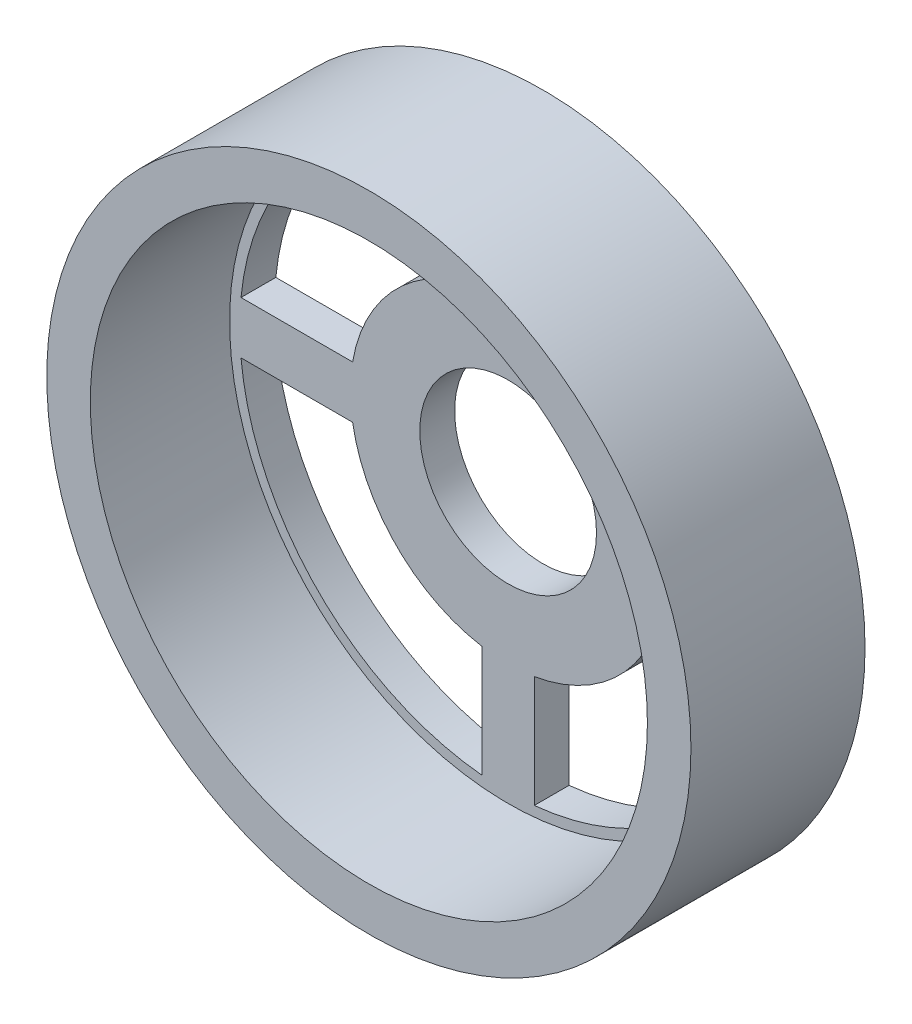
ISO-10303-21;
HEADER;
FILE_DESCRIPTION(('STEP AP214'),'2;1');
FILE_NAME('part.step','',(''),(''),'','','');
FILE_SCHEMA(('AUTOMOTIVE_DESIGN { 1 0 10303 214 1 1 1 1 }'));
ENDSEC;
DATA;
#1=APPLICATION_CONTEXT('core data for automotive mechanical design processes');
#2=APPLICATION_PROTOCOL_DEFINITION('international standard','automotive_design',2000,#1);
#3=PRODUCT_CONTEXT('',#1,'mechanical');
#4=PRODUCT('Part','Part','',(#3));
#5=PRODUCT_RELATED_PRODUCT_CATEGORY('part','',(#4));
#6=PRODUCT_DEFINITION_FORMATION('','',#4);
#7=PRODUCT_DEFINITION_CONTEXT('part definition',#1,'design');
#8=PRODUCT_DEFINITION('design','',#6,#7);
#9=PRODUCT_DEFINITION_SHAPE('','',#8);
#10=(LENGTH_UNIT() NAMED_UNIT(*) SI_UNIT(.MILLI.,.METRE.));
#11=(NAMED_UNIT(*) PLANE_ANGLE_UNIT() SI_UNIT($,.RADIAN.));
#12=(NAMED_UNIT(*) SI_UNIT($,.STERADIAN.) SOLID_ANGLE_UNIT());
#13=UNCERTAINTY_MEASURE_WITH_UNIT(LENGTH_MEASURE(1.E-05),#10,'distance_accuracy_value','');
#14=(GEOMETRIC_REPRESENTATION_CONTEXT(3) GLOBAL_UNCERTAINTY_ASSIGNED_CONTEXT((#13)) GLOBAL_UNIT_ASSIGNED_CONTEXT((#10,
#11,#12)) REPRESENTATION_CONTEXT('',''));
#15=CARTESIAN_POINT('',(0.,0.,0.));
#16=DIRECTION('',(0.,0.,1.));
#17=DIRECTION('',(1.,0.,0.));
#18=AXIS2_PLACEMENT_3D('',#15,#16,#17);
#19=CARTESIAN_POINT('',(0.,0.,2.));
#20=DIRECTION('',(0.,0.,1.));
#21=DIRECTION('',(1.,0.,0.));
#22=AXIS2_PLACEMENT_3D('',#19,#20,#21);
#23=PLANE('',#22);
#24=DIRECTION('',(0.,-1.,0.));
#25=VECTOR('',#24,1.);
#26=CARTESIAN_POINT('',(1.5,0.,2.));
#27=LINE('',#26,#25);
#28=CARTESIAN_POINT('',(1.5,15.3443381778024,2.));
#29=VERTEX_POINT('',#28);
#30=CARTESIAN_POINT('',(1.5,8.9322223454031,2.));
#31=VERTEX_POINT('',#30);
#32=EDGE_CURVE('E281',#29,#31,#27,.T.);
#33=ORIENTED_EDGE('',*,*,#32,.F.);
#34=CARTESIAN_POINT('',(0.,0.,2.));
#35=DIRECTION('',(0.,0.,1.));
#36=DIRECTION('',(1.,0.,0.));
#37=AXIS2_PLACEMENT_3D('',#34,#35,#36);
#38=CIRCLE('',#37,15.4174807966401);
#39=CARTESIAN_POINT('',(15.3443381778024,1.5,2.));
#40=VERTEX_POINT('',#39);
#41=EDGE_CURVE('E273',#40,#29,#38,.T.);
#42=ORIENTED_EDGE('',*,*,#41,.F.);
#43=DIRECTION('',(-1.,0.,0.));
#44=VECTOR('',#43,1.);
#45=CARTESIAN_POINT('',(0.,1.5,2.));
#46=LINE('',#45,#44);
#47=CARTESIAN_POINT('',(8.9322223454031,1.5,2.));
#48=VERTEX_POINT('',#47);
#49=EDGE_CURVE('E275',#40,#48,#46,.T.);
#50=ORIENTED_EDGE('',*,*,#49,.T.);
#51=CARTESIAN_POINT('',(0.,0.,2.));
#52=DIRECTION('',(0.,0.,1.));
#53=DIRECTION('',(1.,0.,0.));
#54=AXIS2_PLACEMENT_3D('',#51,#52,#53);
#55=CIRCLE('',#54,9.05729518276392);
#56=EDGE_CURVE('E278',#48,#31,#55,.T.);
#57=ORIENTED_EDGE('',*,*,#56,.T.);
#58=EDGE_LOOP('',(#33,#42,#50,#57));
#59=FACE_BOUND('',#58,.T.);
#60=DIRECTION('',(-1.,0.,0.));
#61=VECTOR('',#60,1.);
#62=CARTESIAN_POINT('',(0.,-1.5,2.));
#63=LINE('',#62,#61);
#64=CARTESIAN_POINT('',(15.3443381778024,-1.5,2.));
#65=VERTEX_POINT('',#64);
#66=CARTESIAN_POINT('',(8.9322223454031,-1.5,2.));
#67=VERTEX_POINT('',#66);
#68=EDGE_CURVE('E252',#65,#67,#63,.T.);
#69=ORIENTED_EDGE('',*,*,#68,.F.);
#70=CARTESIAN_POINT('',(0.,0.,2.));
#71=DIRECTION('',(0.,0.,1.));
#72=DIRECTION('',(1.,0.,0.));
#73=AXIS2_PLACEMENT_3D('',#70,#71,#72);
#74=CIRCLE('',#73,15.4174807966401);
#75=CARTESIAN_POINT('',(1.5,-15.3443381778024,2.));
#76=VERTEX_POINT('',#75);
#77=EDGE_CURVE('E238',#76,#65,#74,.T.);
#78=ORIENTED_EDGE('',*,*,#77,.F.);
#79=DIRECTION('',(0.,1.,0.));
#80=VECTOR('',#79,1.);
#81=CARTESIAN_POINT('',(1.5,0.,2.));
#82=LINE('',#81,#80);
#83=CARTESIAN_POINT('',(1.5,-8.9322223454031,2.));
#84=VERTEX_POINT('',#83);
#85=EDGE_CURVE('E246',#76,#84,#82,.T.);
#86=ORIENTED_EDGE('',*,*,#85,.T.);
#87=CARTESIAN_POINT('',(0.,0.,2.));
#88=DIRECTION('',(0.,0.,1.));
#89=DIRECTION('',(1.,0.,0.));
#90=AXIS2_PLACEMENT_3D('',#87,#88,#89);
#91=CIRCLE('',#90,9.05729518276392);
#92=EDGE_CURVE('E249',#84,#67,#91,.T.);
#93=ORIENTED_EDGE('',*,*,#92,.T.);
#94=EDGE_LOOP('',(#69,#78,#86,#93));
#95=FACE_BOUND('',#94,.T.);
#96=CARTESIAN_POINT('',(0.,0.,2.));
#97=DIRECTION('',(0.,0.,1.));
#98=DIRECTION('',(1.,0.,0.));
#99=AXIS2_PLACEMENT_3D('',#96,#97,#98);
#100=CIRCLE('',#99,16.);
#101=CARTESIAN_POINT('',(16.,0.,2.));
#102=VERTEX_POINT('',#101);
#103=EDGE_CURVE('E286',#102,#102,#100,.F.);
#104=ORIENTED_EDGE('',*,*,#103,.F.);
#105=EDGE_LOOP('',(#104));
#106=FACE_BOUND('',#105,.T.);
#107=CARTESIAN_POINT('',(0.,0.,2.));
#108=DIRECTION('',(0.,0.,1.));
#109=DIRECTION('',(1.,0.,0.));
#110=AXIS2_PLACEMENT_3D('',#107,#108,#109);
#111=CIRCLE('',#110,5.075);
#112=CARTESIAN_POINT('',(5.075,0.,2.));
#113=VERTEX_POINT('',#112);
#114=EDGE_CURVE('E11',#113,#113,#111,.T.);
#115=ORIENTED_EDGE('',*,*,#114,.F.);
#116=EDGE_LOOP('',(#115));
#117=FACE_BOUND('',#116,.T.);
#118=DIRECTION('',(1.,0.,0.));
#119=VECTOR('',#118,1.);
#120=CARTESIAN_POINT('',(0.,-1.5,2.));
#121=LINE('',#120,#119);
#122=CARTESIAN_POINT('',(-15.3443381778024,-1.5,2.));
#123=VERTEX_POINT('',#122);
#124=CARTESIAN_POINT('',(-8.9322223454031,-1.5,2.));
#125=VERTEX_POINT('',#124);
#126=EDGE_CURVE('E257',#123,#125,#121,.T.);
#127=ORIENTED_EDGE('',*,*,#126,.T.);
#128=CARTESIAN_POINT('',(0.,0.,2.));
#129=DIRECTION('',(0.,0.,1.));
#130=DIRECTION('',(1.,0.,0.));
#131=AXIS2_PLACEMENT_3D('',#128,#129,#130);
#132=CIRCLE('',#131,9.05729518276392);
#133=CARTESIAN_POINT('',(-1.5,-8.9322223454031,2.));
#134=VERTEX_POINT('',#133);
#135=EDGE_CURVE('E260',#125,#134,#132,.T.);
#136=ORIENTED_EDGE('',*,*,#135,.T.);
#137=DIRECTION('',(0.,1.,0.));
#138=VECTOR('',#137,1.);
#139=CARTESIAN_POINT('',(-1.5,0.,2.));
#140=LINE('',#139,#138);
#141=CARTESIAN_POINT('',(-1.5,-15.3443381778024,2.));
#142=VERTEX_POINT('',#141);
#143=EDGE_CURVE('E254',#142,#134,#140,.T.);
#144=ORIENTED_EDGE('',*,*,#143,.F.);
#145=CARTESIAN_POINT('',(0.,0.,2.));
#146=DIRECTION('',(0.,0.,1.));
#147=DIRECTION('',(1.,0.,0.));
#148=AXIS2_PLACEMENT_3D('',#145,#146,#147);
#149=CIRCLE('',#148,15.4174807966401);
#150=EDGE_CURVE('E160',#123,#142,#149,.T.);
#151=ORIENTED_EDGE('',*,*,#150,.F.);
#152=EDGE_LOOP('',(#127,#136,#144,#151));
#153=FACE_BOUND('',#152,.T.);
#154=DIRECTION('',(0.,-1.,0.));
#155=VECTOR('',#154,1.);
#156=CARTESIAN_POINT('',(-1.5,0.,2.));
#157=LINE('',#156,#155);
#158=CARTESIAN_POINT('',(-1.5,15.3443381778024,2.));
#159=VERTEX_POINT('',#158);
#160=CARTESIAN_POINT('',(-1.5,8.9322223454031,2.));
#161=VERTEX_POINT('',#160);
#162=EDGE_CURVE('E267',#159,#161,#157,.T.);
#163=ORIENTED_EDGE('',*,*,#162,.T.);
#164=CARTESIAN_POINT('',(0.,0.,2.));
#165=DIRECTION('',(0.,0.,1.));
#166=DIRECTION('',(1.,0.,0.));
#167=AXIS2_PLACEMENT_3D('',#164,#165,#166);
#168=CIRCLE('',#167,9.05729518276392);
#169=CARTESIAN_POINT('',(-8.9322223454031,1.5,2.));
#170=VERTEX_POINT('',#169);
#171=EDGE_CURVE('E270',#161,#170,#168,.T.);
#172=ORIENTED_EDGE('',*,*,#171,.T.);
#173=DIRECTION('',(1.,0.,0.));
#174=VECTOR('',#173,1.);
#175=CARTESIAN_POINT('',(0.,1.5,2.));
#176=LINE('',#175,#174);
#177=CARTESIAN_POINT('',(-15.3443381778024,1.5,2.));
#178=VERTEX_POINT('',#177);
#179=EDGE_CURVE('E263',#178,#170,#176,.T.);
#180=ORIENTED_EDGE('',*,*,#179,.F.);
#181=CARTESIAN_POINT('',(0.,0.,2.));
#182=DIRECTION('',(0.,0.,1.));
#183=DIRECTION('',(1.,0.,0.));
#184=AXIS2_PLACEMENT_3D('',#181,#182,#183);
#185=CIRCLE('',#184,15.4174807966401);
#186=EDGE_CURVE('E265',#159,#178,#185,.T.);
#187=ORIENTED_EDGE('',*,*,#186,.F.);
#188=EDGE_LOOP('',(#163,#172,#180,#187));
#189=FACE_BOUND('',#188,.T.);
#190=ADVANCED_FACE('F39',(#59,#95,#106,#117,#153,#189),#23,.T.);
#191=CARTESIAN_POINT('',(0.,0.,0.));
#192=DIRECTION('',(0.,0.,1.));
#193=DIRECTION('',(1.,0.,0.));
#194=AXIS2_PLACEMENT_3D('',#191,#192,#193);
#195=PLANE('',#194);
#196=CARTESIAN_POINT('',(0.,0.,0.));
#197=DIRECTION('',(0.,0.,-1.));
#198=DIRECTION('',(-1.,0.,0.));
#199=AXIS2_PLACEMENT_3D('',#196,#197,#198);
#200=CIRCLE('',#199,15.4174807966401);
#201=CARTESIAN_POINT('',(1.5,15.3443381778024,0.));
#202=VERTEX_POINT('',#201);
#203=CARTESIAN_POINT('',(15.3443381778024,1.5,0.));
#204=VERTEX_POINT('',#203);
#205=EDGE_CURVE('E209',#202,#204,#200,.T.);
#206=ORIENTED_EDGE('',*,*,#205,.F.);
#207=DIRECTION('',(0.,1.,0.));
#208=VECTOR('',#207,1.);
#209=CARTESIAN_POINT('',(1.5,0.,0.));
#210=LINE('',#209,#208);
#211=CARTESIAN_POINT('',(1.5,8.9322223454031,0.));
#212=VERTEX_POINT('',#211);
#213=EDGE_CURVE('E207',#212,#202,#210,.T.);
#214=ORIENTED_EDGE('',*,*,#213,.F.);
#215=CARTESIAN_POINT('',(0.,0.,0.));
#216=DIRECTION('',(0.,0.,-1.));
#217=DIRECTION('',(-1.,0.,0.));
#218=AXIS2_PLACEMENT_3D('',#215,#216,#217);
#219=CIRCLE('',#218,9.05729518276392);
#220=CARTESIAN_POINT('',(8.9322223454031,1.5,0.));
#221=VERTEX_POINT('',#220);
#222=EDGE_CURVE('E215',#212,#221,#219,.T.);
#223=ORIENTED_EDGE('',*,*,#222,.T.);
#224=DIRECTION('',(1.,0.,0.));
#225=VECTOR('',#224,1.);
#226=CARTESIAN_POINT('',(0.,1.5,0.));
#227=LINE('',#226,#225);
#228=EDGE_CURVE('E212',#221,#204,#227,.T.);
#229=ORIENTED_EDGE('',*,*,#228,.T.);
#230=EDGE_LOOP('',(#206,#214,#223,#229));
#231=FACE_BOUND('',#230,.T.);
#232=CARTESIAN_POINT('',(0.,0.,0.));
#233=DIRECTION('',(0.,0.,-1.));
#234=DIRECTION('',(-1.,0.,0.));
#235=AXIS2_PLACEMENT_3D('',#232,#233,#234);
#236=CIRCLE('',#235,9.05729518276392);
#237=CARTESIAN_POINT('',(-1.5,-8.9322223454031,0.));
#238=VERTEX_POINT('',#237);
#239=CARTESIAN_POINT('',(-8.9322223454031,-1.5,0.));
#240=VERTEX_POINT('',#239);
#241=EDGE_CURVE('E173',#238,#240,#236,.T.);
#242=ORIENTED_EDGE('',*,*,#241,.T.);
#243=DIRECTION('',(-1.,0.,0.));
#244=VECTOR('',#243,1.);
#245=CARTESIAN_POINT('',(0.,-1.5,0.));
#246=LINE('',#245,#244);
#247=CARTESIAN_POINT('',(-15.3443381778024,-1.5,0.));
#248=VERTEX_POINT('',#247);
#249=EDGE_CURVE('E177',#240,#248,#246,.T.);
#250=ORIENTED_EDGE('',*,*,#249,.T.);
#251=CARTESIAN_POINT('',(0.,0.,0.));
#252=DIRECTION('',(0.,0.,-1.));
#253=DIRECTION('',(-1.,0.,0.));
#254=AXIS2_PLACEMENT_3D('',#251,#252,#253);
#255=CIRCLE('',#254,15.4174807966401);
#256=CARTESIAN_POINT('',(-1.5,-15.3443381778024,0.));
#257=VERTEX_POINT('',#256);
#258=EDGE_CURVE('E157',#257,#248,#255,.T.);
#259=ORIENTED_EDGE('',*,*,#258,.F.);
#260=DIRECTION('',(0.,-1.,0.));
#261=VECTOR('',#260,1.);
#262=CARTESIAN_POINT('',(-1.5,0.,0.));
#263=LINE('',#262,#261);
#264=EDGE_CURVE('E168',#238,#257,#263,.T.);
#265=ORIENTED_EDGE('',*,*,#264,.F.);
#266=EDGE_LOOP('',(#242,#250,#259,#265));
#267=FACE_BOUND('',#266,.T.);
#268=CARTESIAN_POINT('',(0.,0.,0.));
#269=DIRECTION('',(0.,0.,-1.));
#270=DIRECTION('',(-1.,0.,0.));
#271=AXIS2_PLACEMENT_3D('',#268,#269,#270);
#272=CIRCLE('',#271,15.4174807966401);
#273=CARTESIAN_POINT('',(15.3443381778024,-1.5,0.));
#274=VERTEX_POINT('',#273);
#275=CARTESIAN_POINT('',(1.5,-15.3443381778024,0.));
#276=VERTEX_POINT('',#275);
#277=EDGE_CURVE('E226',#274,#276,#272,.T.);
#278=ORIENTED_EDGE('',*,*,#277,.F.);
#279=DIRECTION('',(1.,0.,0.));
#280=VECTOR('',#279,1.);
#281=CARTESIAN_POINT('',(0.,-1.5,0.));
#282=LINE('',#281,#280);
#283=CARTESIAN_POINT('',(8.9322223454031,-1.5,0.));
#284=VERTEX_POINT('',#283);
#285=EDGE_CURVE('E184',#284,#274,#282,.T.);
#286=ORIENTED_EDGE('',*,*,#285,.F.);
#287=CARTESIAN_POINT('',(0.,0.,0.));
#288=DIRECTION('',(0.,0.,-1.));
#289=DIRECTION('',(-1.,0.,0.));
#290=AXIS2_PLACEMENT_3D('',#287,#288,#289);
#291=CIRCLE('',#290,9.05729518276392);
#292=CARTESIAN_POINT('',(1.5,-8.9322223454031,0.));
#293=VERTEX_POINT('',#292);
#294=EDGE_CURVE('E232',#284,#293,#291,.T.);
#295=ORIENTED_EDGE('',*,*,#294,.T.);
#296=DIRECTION('',(0.,-1.,0.));
#297=VECTOR('',#296,1.);
#298=CARTESIAN_POINT('',(1.5,0.,0.));
#299=LINE('',#298,#297);
#300=EDGE_CURVE('E229',#293,#276,#299,.T.);
#301=ORIENTED_EDGE('',*,*,#300,.T.);
#302=EDGE_LOOP('',(#278,#286,#295,#301));
#303=FACE_BOUND('',#302,.T.);
#304=CARTESIAN_POINT('',(0.,0.,0.));
#305=DIRECTION('',(0.,0.,1.));
#306=DIRECTION('',(1.,0.,0.));
#307=AXIS2_PLACEMENT_3D('',#304,#305,#306);
#308=CIRCLE('',#307,5.075);
#309=CARTESIAN_POINT('',(5.075,0.,0.));
#310=VERTEX_POINT('',#309);
#311=EDGE_CURVE('E43',#310,#310,#308,.T.);
#312=ORIENTED_EDGE('',*,*,#311,.T.);
#313=EDGE_LOOP('',(#312));
#314=FACE_BOUND('',#313,.T.);
#315=CARTESIAN_POINT('',(0.,0.,0.));
#316=DIRECTION('',(0.,0.,-1.));
#317=DIRECTION('',(-1.,0.,0.));
#318=AXIS2_PLACEMENT_3D('',#315,#316,#317);
#319=CIRCLE('',#318,9.05729518276392);
#320=CARTESIAN_POINT('',(-8.9322223454031,1.5,0.));
#321=VERTEX_POINT('',#320);
#322=CARTESIAN_POINT('',(-1.5,8.9322223454031,0.));
#323=VERTEX_POINT('',#322);
#324=EDGE_CURVE('E187',#321,#323,#319,.T.);
#325=ORIENTED_EDGE('',*,*,#324,.T.);
#326=DIRECTION('',(0.,1.,0.));
#327=VECTOR('',#326,1.);
#328=CARTESIAN_POINT('',(-1.5,0.,0.));
#329=LINE('',#328,#327);
#330=CARTESIAN_POINT('',(-1.5,15.3443381778024,0.));
#331=VERTEX_POINT('',#330);
#332=EDGE_CURVE('E196',#323,#331,#329,.T.);
#333=ORIENTED_EDGE('',*,*,#332,.T.);
#334=CARTESIAN_POINT('',(0.,0.,0.));
#335=DIRECTION('',(0.,0.,-1.));
#336=DIRECTION('',(-1.,0.,0.));
#337=AXIS2_PLACEMENT_3D('',#334,#335,#336);
#338=CIRCLE('',#337,15.4174807966401);
#339=CARTESIAN_POINT('',(-15.3443381778024,1.5,0.));
#340=VERTEX_POINT('',#339);
#341=EDGE_CURVE('E193',#340,#331,#338,.T.);
#342=ORIENTED_EDGE('',*,*,#341,.F.);
#343=DIRECTION('',(-1.,0.,0.));
#344=VECTOR('',#343,1.);
#345=CARTESIAN_POINT('',(0.,1.5,0.));
#346=LINE('',#345,#344);
#347=EDGE_CURVE('E190',#321,#340,#346,.T.);
#348=ORIENTED_EDGE('',*,*,#347,.F.);
#349=EDGE_LOOP('',(#325,#333,#342,#348));
#350=FACE_BOUND('',#349,.T.);
#351=CARTESIAN_POINT('',(0.,0.,0.));
#352=DIRECTION('',(0.,0.,1.));
#353=DIRECTION('',(1.,0.,0.));
#354=AXIS2_PLACEMENT_3D('',#351,#352,#353);
#355=CIRCLE('',#354,18.5);
#356=CARTESIAN_POINT('',(18.5,0.,0.));
#357=VERTEX_POINT('',#356);
#358=EDGE_CURVE('E210',#357,#357,#355,.T.);
#359=ORIENTED_EDGE('',*,*,#358,.F.);
#360=EDGE_LOOP('',(#359));
#361=FACE_BOUND('',#360,.T.);
#362=ADVANCED_FACE('F41',(#231,#267,#303,#314,#350,#361),#195,.F.);
#363=CARTESIAN_POINT('',(0.,0.,2.));
#364=DIRECTION('',(0.,0.,-1.));
#365=DIRECTION('',(-1.,0.,0.));
#366=AXIS2_PLACEMENT_3D('',#363,#364,#365);
#367=CYLINDRICAL_SURFACE('',#366,5.075);
#368=ORIENTED_EDGE('',*,*,#114,.T.);
#369=EDGE_LOOP('',(#368));
#370=FACE_BOUND('',#369,.T.);
#371=ORIENTED_EDGE('',*,*,#311,.F.);
#372=EDGE_LOOP('',(#371));
#373=FACE_BOUND('',#372,.T.);
#374=ADVANCED_FACE('F295',(#370,#373),#367,.F.);
#375=CARTESIAN_POINT('',(0.,0.,10.));
#376=DIRECTION('',(0.,0.,1.));
#377=DIRECTION('',(1.,0.,0.));
#378=AXIS2_PLACEMENT_3D('',#375,#376,#377);
#379=PLANE('',#378);
#380=CARTESIAN_POINT('',(0.,0.,10.));
#381=DIRECTION('',(0.,0.,1.));
#382=DIRECTION('',(1.,0.,0.));
#383=AXIS2_PLACEMENT_3D('',#380,#381,#382);
#384=CIRCLE('',#383,16.);
#385=CARTESIAN_POINT('',(16.,0.,10.));
#386=VERTEX_POINT('',#385);
#387=EDGE_CURVE('E283',#386,#386,#384,.T.);
#388=ORIENTED_EDGE('',*,*,#387,.F.);
#389=EDGE_LOOP('',(#388));
#390=FACE_BOUND('',#389,.T.);
#391=CARTESIAN_POINT('',(0.,0.,10.));
#392=DIRECTION('',(0.,0.,1.));
#393=DIRECTION('',(1.,0.,0.));
#394=AXIS2_PLACEMENT_3D('',#391,#392,#393);
#395=CIRCLE('',#394,18.5);
#396=CARTESIAN_POINT('',(18.5,0.,10.));
#397=VERTEX_POINT('',#396);
#398=EDGE_CURVE('E389',#397,#397,#395,.T.);
#399=ORIENTED_EDGE('',*,*,#398,.T.);
#400=EDGE_LOOP('',(#399));
#401=FACE_BOUND('',#400,.T.);
#402=ADVANCED_FACE('F297',(#390,#401),#379,.T.);
#403=CARTESIAN_POINT('',(0.,0.,10.));
#404=DIRECTION('',(0.,0.,-1.));
#405=DIRECTION('',(-1.,0.,0.));
#406=AXIS2_PLACEMENT_3D('',#403,#404,#405);
#407=CYLINDRICAL_SURFACE('',#406,16.);
#408=ORIENTED_EDGE('',*,*,#103,.T.);
#409=EDGE_LOOP('',(#408));
#410=FACE_BOUND('',#409,.T.);
#411=ORIENTED_EDGE('',*,*,#387,.T.);
#412=EDGE_LOOP('',(#411));
#413=FACE_BOUND('',#412,.T.);
#414=ADVANCED_FACE('F304',(#410,#413),#407,.F.);
#415=CARTESIAN_POINT('',(0.,-1.5,10.));
#416=DIRECTION('',(0.,1.,0.));
#417=DIRECTION('',(0.,0.,1.));
#418=AXIS2_PLACEMENT_3D('',#415,#416,#417);
#419=PLANE('',#418);
#420=ORIENTED_EDGE('',*,*,#68,.T.);
#421=DIRECTION('',(0.,0.,-1.));
#422=VECTOR('',#421,1.);
#423=CARTESIAN_POINT('',(8.9322223454031,-1.5,10.));
#424=LINE('',#423,#422);
#425=EDGE_CURVE('E236',#67,#284,#424,.T.);
#426=ORIENTED_EDGE('',*,*,#425,.T.);
#427=ORIENTED_EDGE('',*,*,#285,.T.);
#428=DIRECTION('',(0.,0.,-1.));
#429=VECTOR('',#428,1.);
#430=CARTESIAN_POINT('',(15.3443381778024,-1.5,10.));
#431=LINE('',#430,#429);
#432=EDGE_CURVE('E235',#65,#274,#431,.T.);
#433=ORIENTED_EDGE('',*,*,#432,.F.);
#434=EDGE_LOOP('',(#420,#426,#427,#433));
#435=FACE_BOUND('',#434,.T.);
#436=ADVANCED_FACE('F368',(#435),#419,.F.);
#437=CARTESIAN_POINT('',(0.,0.,10.));
#438=DIRECTION('',(0.,0.,-1.));
#439=DIRECTION('',(-1.,0.,0.));
#440=AXIS2_PLACEMENT_3D('',#437,#438,#439);
#441=CYLINDRICAL_SURFACE('',#440,9.05729518276392);
#442=DIRECTION('',(0.,0.,-1.));
#443=VECTOR('',#442,1.);
#444=CARTESIAN_POINT('',(1.5,-8.9322223454031,10.));
#445=LINE('',#444,#443);
#446=EDGE_CURVE('E239',#84,#293,#445,.T.);
#447=ORIENTED_EDGE('',*,*,#446,.T.);
#448=ORIENTED_EDGE('',*,*,#294,.F.);
#449=ORIENTED_EDGE('',*,*,#425,.F.);
#450=ORIENTED_EDGE('',*,*,#92,.F.);
#451=EDGE_LOOP('',(#447,#448,#449,#450));
#452=FACE_BOUND('',#451,.T.);
#453=ADVANCED_FACE('F364',(#452),#441,.T.);
#454=CARTESIAN_POINT('',(1.5,0.,10.));
#455=DIRECTION('',(1.,0.,0.));
#456=DIRECTION('',(0.,0.,-1.));
#457=AXIS2_PLACEMENT_3D('',#454,#455,#456);
#458=PLANE('',#457);
#459=DIRECTION('',(0.,0.,-1.));
#460=VECTOR('',#459,1.);
#461=CARTESIAN_POINT('',(1.5,-15.3443381778024,10.));
#462=LINE('',#461,#460);
#463=EDGE_CURVE('E241',#76,#276,#462,.T.);
#464=ORIENTED_EDGE('',*,*,#463,.T.);
#465=ORIENTED_EDGE('',*,*,#300,.F.);
#466=ORIENTED_EDGE('',*,*,#446,.F.);
#467=ORIENTED_EDGE('',*,*,#85,.F.);
#468=EDGE_LOOP('',(#464,#465,#466,#467));
#469=FACE_BOUND('',#468,.T.);
#470=ADVANCED_FACE('F367',(#469),#458,.T.);
#471=CARTESIAN_POINT('',(0.,0.,10.));
#472=DIRECTION('',(0.,0.,-1.));
#473=DIRECTION('',(-1.,0.,0.));
#474=AXIS2_PLACEMENT_3D('',#471,#472,#473);
#475=CYLINDRICAL_SURFACE('',#474,15.4174807966401);
#476=ORIENTED_EDGE('',*,*,#77,.T.);
#477=ORIENTED_EDGE('',*,*,#432,.T.);
#478=ORIENTED_EDGE('',*,*,#277,.T.);
#479=ORIENTED_EDGE('',*,*,#463,.F.);
#480=EDGE_LOOP('',(#476,#477,#478,#479));
#481=FACE_BOUND('',#480,.T.);
#482=ADVANCED_FACE('F372',(#481),#475,.F.);
#483=CARTESIAN_POINT('',(0.,0.,10.));
#484=DIRECTION('',(0.,0.,-1.));
#485=DIRECTION('',(-1.,0.,0.));
#486=AXIS2_PLACEMENT_3D('',#483,#484,#485);
#487=CYLINDRICAL_SURFACE('',#486,9.05729518276392);
#488=DIRECTION('',(0.,0.,-1.));
#489=VECTOR('',#488,1.);
#490=CARTESIAN_POINT('',(-8.9322223454031,-1.5,10.));
#491=LINE('',#490,#489);
#492=EDGE_CURVE('E182',#125,#240,#491,.T.);
#493=ORIENTED_EDGE('',*,*,#492,.T.);
#494=ORIENTED_EDGE('',*,*,#241,.F.);
#495=DIRECTION('',(0.,0.,-1.));
#496=VECTOR('',#495,1.);
#497=CARTESIAN_POINT('',(-1.5,-8.9322223454031,10.));
#498=LINE('',#497,#496);
#499=EDGE_CURVE('E164',#134,#238,#498,.T.);
#500=ORIENTED_EDGE('',*,*,#499,.F.);
#501=ORIENTED_EDGE('',*,*,#135,.F.);
#502=EDGE_LOOP('',(#493,#494,#500,#501));
#503=FACE_BOUND('',#502,.T.);
#504=ADVANCED_FACE('F376',(#503),#487,.T.);
#505=CARTESIAN_POINT('',(0.,-1.5,10.));
#506=DIRECTION('',(0.,-1.,0.));
#507=DIRECTION('',(0.,0.,-1.));
#508=AXIS2_PLACEMENT_3D('',#505,#506,#507);
#509=PLANE('',#508);
#510=DIRECTION('',(0.,0.,-1.));
#511=VECTOR('',#510,1.);
#512=CARTESIAN_POINT('',(-15.3443381778024,-1.5,10.));
#513=LINE('',#512,#511);
#514=EDGE_CURVE('E163',#123,#248,#513,.T.);
#515=ORIENTED_EDGE('',*,*,#514,.T.);
#516=ORIENTED_EDGE('',*,*,#249,.F.);
#517=ORIENTED_EDGE('',*,*,#492,.F.);
#518=ORIENTED_EDGE('',*,*,#126,.F.);
#519=EDGE_LOOP('',(#515,#516,#517,#518));
#520=FACE_BOUND('',#519,.T.);
#521=ADVANCED_FACE('F397',(#520),#509,.T.);
#522=CARTESIAN_POINT('',(0.,0.,10.));
#523=DIRECTION('',(0.,0.,-1.));
#524=DIRECTION('',(-1.,0.,0.));
#525=AXIS2_PLACEMENT_3D('',#522,#523,#524);
#526=CYLINDRICAL_SURFACE('',#525,15.4174807966401);
#527=ORIENTED_EDGE('',*,*,#150,.T.);
#528=DIRECTION('',(0.,0.,-1.));
#529=VECTOR('',#528,1.);
#530=CARTESIAN_POINT('',(-1.5,-15.3443381778024,10.));
#531=LINE('',#530,#529);
#532=EDGE_CURVE('E152',#142,#257,#531,.T.);
#533=ORIENTED_EDGE('',*,*,#532,.T.);
#534=ORIENTED_EDGE('',*,*,#258,.T.);
#535=ORIENTED_EDGE('',*,*,#514,.F.);
#536=EDGE_LOOP('',(#527,#533,#534,#535));
#537=FACE_BOUND('',#536,.T.);
#538=ADVANCED_FACE('F154',(#537),#526,.F.);
#539=CARTESIAN_POINT('',(-1.5,0.,10.));
#540=DIRECTION('',(1.,0.,0.));
#541=DIRECTION('',(0.,0.,-1.));
#542=AXIS2_PLACEMENT_3D('',#539,#540,#541);
#543=PLANE('',#542);
#544=ORIENTED_EDGE('',*,*,#143,.T.);
#545=ORIENTED_EDGE('',*,*,#499,.T.);
#546=ORIENTED_EDGE('',*,*,#264,.T.);
#547=ORIENTED_EDGE('',*,*,#532,.F.);
#548=EDGE_LOOP('',(#544,#545,#546,#547));
#549=FACE_BOUND('',#548,.T.);
#550=ADVANCED_FACE('F169',(#549),#543,.F.);
#551=CARTESIAN_POINT('',(0.,0.,10.));
#552=DIRECTION('',(0.,0.,-1.));
#553=DIRECTION('',(-1.,0.,0.));
#554=AXIS2_PLACEMENT_3D('',#551,#552,#553);
#555=CYLINDRICAL_SURFACE('',#554,9.05729518276392);
#556=DIRECTION('',(0.,0.,-1.));
#557=VECTOR('',#556,1.);
#558=CARTESIAN_POINT('',(-1.5,8.9322223454031,10.));
#559=LINE('',#558,#557);
#560=EDGE_CURVE('E200',#161,#323,#559,.T.);
#561=ORIENTED_EDGE('',*,*,#560,.T.);
#562=ORIENTED_EDGE('',*,*,#324,.F.);
#563=DIRECTION('',(0.,0.,-1.));
#564=VECTOR('',#563,1.);
#565=CARTESIAN_POINT('',(-8.9322223454031,1.5,10.));
#566=LINE('',#565,#564);
#567=EDGE_CURVE('E199',#170,#321,#566,.T.);
#568=ORIENTED_EDGE('',*,*,#567,.F.);
#569=ORIENTED_EDGE('',*,*,#171,.F.);
#570=EDGE_LOOP('',(#561,#562,#568,#569));
#571=FACE_BOUND('',#570,.T.);
#572=ADVANCED_FACE('F336',(#571),#555,.T.);
#573=CARTESIAN_POINT('',(-1.5,0.,10.));
#574=DIRECTION('',(-1.,0.,0.));
#575=DIRECTION('',(0.,0.,1.));
#576=AXIS2_PLACEMENT_3D('',#573,#574,#575);
#577=PLANE('',#576);
#578=DIRECTION('',(0.,0.,-1.));
#579=VECTOR('',#578,1.);
#580=CARTESIAN_POINT('',(-1.5,15.3443381778024,10.));
#581=LINE('',#580,#579);
#582=EDGE_CURVE('E202',#159,#331,#581,.T.);
#583=ORIENTED_EDGE('',*,*,#582,.T.);
#584=ORIENTED_EDGE('',*,*,#332,.F.);
#585=ORIENTED_EDGE('',*,*,#560,.F.);
#586=ORIENTED_EDGE('',*,*,#162,.F.);
#587=EDGE_LOOP('',(#583,#584,#585,#586));
#588=FACE_BOUND('',#587,.T.);
#589=ADVANCED_FACE('F327',(#588),#577,.T.);
#590=CARTESIAN_POINT('',(0.,0.,10.));
#591=DIRECTION('',(0.,0.,-1.));
#592=DIRECTION('',(-1.,0.,0.));
#593=AXIS2_PLACEMENT_3D('',#590,#591,#592);
#594=CYLINDRICAL_SURFACE('',#593,15.4174807966401);
#595=ORIENTED_EDGE('',*,*,#186,.T.);
#596=DIRECTION('',(0.,0.,-1.));
#597=VECTOR('',#596,1.);
#598=CARTESIAN_POINT('',(-15.3443381778024,1.5,10.));
#599=LINE('',#598,#597);
#600=EDGE_CURVE('E62',#178,#340,#599,.T.);
#601=ORIENTED_EDGE('',*,*,#600,.T.);
#602=ORIENTED_EDGE('',*,*,#341,.T.);
#603=ORIENTED_EDGE('',*,*,#582,.F.);
#604=EDGE_LOOP('',(#595,#601,#602,#603));
#605=FACE_BOUND('',#604,.T.);
#606=ADVANCED_FACE('F330',(#605),#594,.F.);
#607=CARTESIAN_POINT('',(0.,1.5,10.));
#608=DIRECTION('',(0.,-1.,0.));
#609=DIRECTION('',(0.,0.,-1.));
#610=AXIS2_PLACEMENT_3D('',#607,#608,#609);
#611=PLANE('',#610);
#612=ORIENTED_EDGE('',*,*,#179,.T.);
#613=ORIENTED_EDGE('',*,*,#567,.T.);
#614=ORIENTED_EDGE('',*,*,#347,.T.);
#615=ORIENTED_EDGE('',*,*,#600,.F.);
#616=EDGE_LOOP('',(#612,#613,#614,#615));
#617=FACE_BOUND('',#616,.T.);
#618=ADVANCED_FACE('F337',(#617),#611,.F.);
#619=CARTESIAN_POINT('',(1.5,0.,10.));
#620=DIRECTION('',(-1.,0.,0.));
#621=DIRECTION('',(0.,0.,1.));
#622=AXIS2_PLACEMENT_3D('',#619,#620,#621);
#623=PLANE('',#622);
#624=ORIENTED_EDGE('',*,*,#32,.T.);
#625=DIRECTION('',(0.,0.,-1.));
#626=VECTOR('',#625,1.);
#627=CARTESIAN_POINT('',(1.5,8.9322223454031,10.));
#628=LINE('',#627,#626);
#629=EDGE_CURVE('E191',#31,#212,#628,.T.);
#630=ORIENTED_EDGE('',*,*,#629,.T.);
#631=ORIENTED_EDGE('',*,*,#213,.T.);
#632=DIRECTION('',(0.,0.,-1.));
#633=VECTOR('',#632,1.);
#634=CARTESIAN_POINT('',(1.5,15.3443381778024,10.));
#635=LINE('',#634,#633);
#636=EDGE_CURVE('E218',#29,#202,#635,.T.);
#637=ORIENTED_EDGE('',*,*,#636,.F.);
#638=EDGE_LOOP('',(#624,#630,#631,#637));
#639=FACE_BOUND('',#638,.T.);
#640=ADVANCED_FACE('F339',(#639),#623,.F.);
#641=CARTESIAN_POINT('',(0.,0.,10.));
#642=DIRECTION('',(0.,0.,-1.));
#643=DIRECTION('',(-1.,0.,0.));
#644=AXIS2_PLACEMENT_3D('',#641,#642,#643);
#645=CYLINDRICAL_SURFACE('',#644,9.05729518276392);
#646=DIRECTION('',(0.,0.,-1.));
#647=VECTOR('',#646,1.);
#648=CARTESIAN_POINT('',(8.9322223454031,1.5,10.));
#649=LINE('',#648,#647);
#650=EDGE_CURVE('E220',#48,#221,#649,.T.);
#651=ORIENTED_EDGE('',*,*,#650,.T.);
#652=ORIENTED_EDGE('',*,*,#222,.F.);
#653=ORIENTED_EDGE('',*,*,#629,.F.);
#654=ORIENTED_EDGE('',*,*,#56,.F.);
#655=EDGE_LOOP('',(#651,#652,#653,#654));
#656=FACE_BOUND('',#655,.T.);
#657=ADVANCED_FACE('F345',(#656),#645,.T.);
#658=CARTESIAN_POINT('',(0.,1.5,10.));
#659=DIRECTION('',(0.,1.,0.));
#660=DIRECTION('',(0.,0.,1.));
#661=AXIS2_PLACEMENT_3D('',#658,#659,#660);
#662=PLANE('',#661);
#663=DIRECTION('',(0.,0.,-1.));
#664=VECTOR('',#663,1.);
#665=CARTESIAN_POINT('',(15.3443381778024,1.5,10.));
#666=LINE('',#665,#664);
#667=EDGE_CURVE('E54',#40,#204,#666,.T.);
#668=ORIENTED_EDGE('',*,*,#667,.T.);
#669=ORIENTED_EDGE('',*,*,#228,.F.);
#670=ORIENTED_EDGE('',*,*,#650,.F.);
#671=ORIENTED_EDGE('',*,*,#49,.F.);
#672=EDGE_LOOP('',(#668,#669,#670,#671));
#673=FACE_BOUND('',#672,.T.);
#674=ADVANCED_FACE('F355',(#673),#662,.T.);
#675=CARTESIAN_POINT('',(0.,0.,10.));
#676=DIRECTION('',(0.,0.,-1.));
#677=DIRECTION('',(-1.,0.,0.));
#678=AXIS2_PLACEMENT_3D('',#675,#676,#677);
#679=CYLINDRICAL_SURFACE('',#678,15.4174807966401);
#680=ORIENTED_EDGE('',*,*,#41,.T.);
#681=ORIENTED_EDGE('',*,*,#636,.T.);
#682=ORIENTED_EDGE('',*,*,#205,.T.);
#683=ORIENTED_EDGE('',*,*,#667,.F.);
#684=EDGE_LOOP('',(#680,#681,#682,#683));
#685=FACE_BOUND('',#684,.T.);
#686=ADVANCED_FACE('F359',(#685),#679,.F.);
#687=CARTESIAN_POINT('',(0.,0.,0.));
#688=DIRECTION('',(0.,0.,1.));
#689=DIRECTION('',(1.,0.,0.));
#690=AXIS2_PLACEMENT_3D('',#687,#688,#689);
#691=CYLINDRICAL_SURFACE('',#690,18.5);
#692=ORIENTED_EDGE('',*,*,#358,.T.);
#693=EDGE_LOOP('',(#692));
#694=FACE_BOUND('',#693,.T.);
#695=ORIENTED_EDGE('',*,*,#398,.F.);
#696=EDGE_LOOP('',(#695));
#697=FACE_BOUND('',#696,.T.);
#698=ADVANCED_FACE('F362',(#694,#697),#691,.T.);
#699=CLOSED_SHELL('',(#190,#362,#374,#402,#414,#436,#453,#470,#482,#504,#521,#538,#550,#572,
#589,#606,#618,#640,#657,#674,#686,#698));
#700=MANIFOLD_SOLID_BREP('B2',#699);
#701=ADVANCED_BREP_SHAPE_REPRESENTATION('',(#18,#700),#14);
#702=SHAPE_DEFINITION_REPRESENTATION(#9,#701);
ENDSEC;
END-ISO-10303-21;
